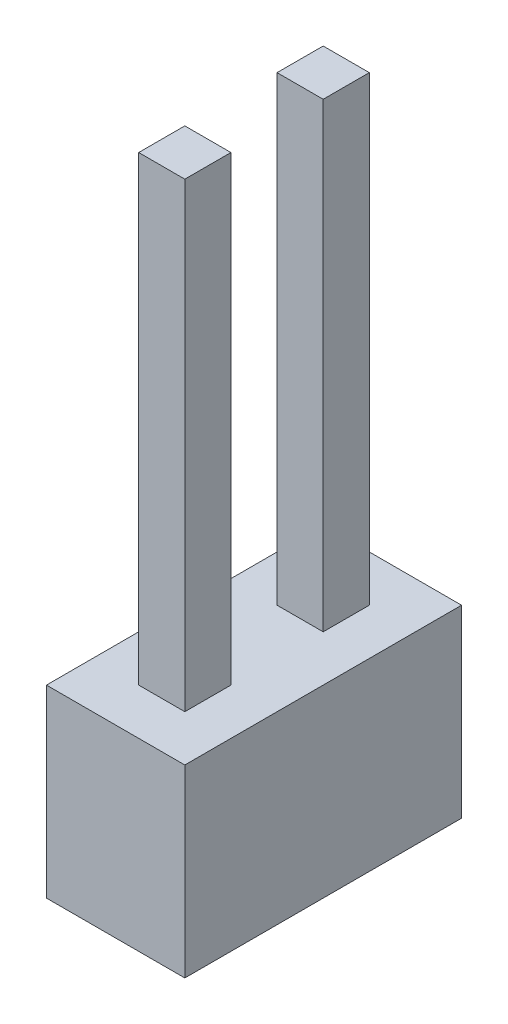
ISO-10303-21;
HEADER;
FILE_DESCRIPTION(('STEP AP214'),'2;1');
FILE_NAME('part.step','',(''),(''),'','','');
FILE_SCHEMA(('AUTOMOTIVE_DESIGN { 1 0 10303 214 1 1 1 1 }'));
ENDSEC;
DATA;
#1=APPLICATION_CONTEXT('core data for automotive mechanical design processes');
#2=APPLICATION_PROTOCOL_DEFINITION('international standard','automotive_design',2000,#1);
#3=PRODUCT_CONTEXT('',#1,'mechanical');
#4=PRODUCT('Part','Part','',(#3));
#5=PRODUCT_RELATED_PRODUCT_CATEGORY('part','',(#4));
#6=PRODUCT_DEFINITION_FORMATION('','',#4);
#7=PRODUCT_DEFINITION_CONTEXT('part definition',#1,'design');
#8=PRODUCT_DEFINITION('design','',#6,#7);
#9=PRODUCT_DEFINITION_SHAPE('','',#8);
#10=(LENGTH_UNIT() NAMED_UNIT(*) SI_UNIT(.MILLI.,.METRE.));
#11=(NAMED_UNIT(*) PLANE_ANGLE_UNIT() SI_UNIT($,.RADIAN.));
#12=(NAMED_UNIT(*) SI_UNIT($,.STERADIAN.) SOLID_ANGLE_UNIT());
#13=UNCERTAINTY_MEASURE_WITH_UNIT(LENGTH_MEASURE(1.E-05),#10,'distance_accuracy_value','');
#14=(GEOMETRIC_REPRESENTATION_CONTEXT(3) GLOBAL_UNCERTAINTY_ASSIGNED_CONTEXT((#13)) GLOBAL_UNIT_ASSIGNED_CONTEXT((#10,
#11,#12)) REPRESENTATION_CONTEXT('',''));
#15=CARTESIAN_POINT('',(0.,0.,0.));
#16=DIRECTION('',(0.,0.,1.));
#17=DIRECTION('',(1.,0.,0.));
#18=AXIS2_PLACEMENT_3D('',#15,#16,#17);
#19=CARTESIAN_POINT('',(0.,3.048,-4.572));
#20=DIRECTION('',(0.,-1.,0.));
#21=DIRECTION('',(0.,0.,-1.));
#22=AXIS2_PLACEMENT_3D('',#19,#20,#21);
#23=PLANE('',#22);
#24=DIRECTION('',(0.,0.,1.));
#25=VECTOR('',#24,1.);
#26=CARTESIAN_POINT('',(0.761999999999999,3.048,-0.762));
#27=LINE('',#26,#25);
#28=CARTESIAN_POINT('',(0.761999999999999,3.048,-1.524));
#29=VERTEX_POINT('',#28);
#30=CARTESIAN_POINT('',(0.761999999999999,3.048,-0.762));
#31=VERTEX_POINT('',#30);
#32=EDGE_CURVE('E144',#29,#31,#27,.T.);
#33=ORIENTED_EDGE('',*,*,#32,.F.);
#34=DIRECTION('',(-1.,0.,0.));
#35=VECTOR('',#34,1.);
#36=CARTESIAN_POINT('',(0.761999999999999,3.048,-1.524));
#37=LINE('',#36,#35);
#38=CARTESIAN_POINT('',(1.524,3.048,-1.524));
#39=VERTEX_POINT('',#38);
#40=EDGE_CURVE('E157',#39,#29,#37,.T.);
#41=ORIENTED_EDGE('',*,*,#40,.F.);
#42=DIRECTION('',(0.,0.,-1.));
#43=VECTOR('',#42,1.);
#44=CARTESIAN_POINT('',(1.524,3.048,-0.762));
#45=LINE('',#44,#43);
#46=CARTESIAN_POINT('',(1.524,3.048,-0.762));
#47=VERTEX_POINT('',#46);
#48=EDGE_CURVE('E166',#47,#39,#45,.T.);
#49=ORIENTED_EDGE('',*,*,#48,.F.);
#50=DIRECTION('',(1.,0.,0.));
#51=VECTOR('',#50,1.);
#52=CARTESIAN_POINT('',(0.761999999999999,3.048,-0.762));
#53=LINE('',#52,#51);
#54=EDGE_CURVE('E147',#31,#47,#53,.T.);
#55=ORIENTED_EDGE('',*,*,#54,.F.);
#56=EDGE_LOOP('',(#33,#41,#49,#55));
#57=FACE_BOUND('',#56,.T.);
#58=DIRECTION('',(0.,0.,1.));
#59=VECTOR('',#58,1.);
#60=CARTESIAN_POINT('',(0.,3.048,0.));
#61=LINE('',#60,#59);
#62=CARTESIAN_POINT('',(0.,3.048,-4.572));
#63=VERTEX_POINT('',#62);
#64=CARTESIAN_POINT('',(0.,3.048,0.));
#65=VERTEX_POINT('',#64);
#66=EDGE_CURVE('E183',#63,#65,#61,.T.);
#67=ORIENTED_EDGE('',*,*,#66,.T.);
#68=DIRECTION('',(1.,0.,0.));
#69=VECTOR('',#68,1.);
#70=CARTESIAN_POINT('',(0.,3.048,0.));
#71=LINE('',#70,#69);
#72=CARTESIAN_POINT('',(2.286,3.048,0.));
#73=VERTEX_POINT('',#72);
#74=EDGE_CURVE('E186',#65,#73,#71,.T.);
#75=ORIENTED_EDGE('',*,*,#74,.T.);
#76=DIRECTION('',(0.,0.,-1.));
#77=VECTOR('',#76,1.);
#78=CARTESIAN_POINT('',(2.286,3.048,0.));
#79=LINE('',#78,#77);
#80=CARTESIAN_POINT('',(2.286,3.048,-4.572));
#81=VERTEX_POINT('',#80);
#82=EDGE_CURVE('E189',#73,#81,#79,.T.);
#83=ORIENTED_EDGE('',*,*,#82,.T.);
#84=DIRECTION('',(-1.,0.,0.));
#85=VECTOR('',#84,1.);
#86=CARTESIAN_POINT('',(0.,3.048,-4.572));
#87=LINE('',#86,#85);
#88=EDGE_CURVE('E191',#81,#63,#87,.T.);
#89=ORIENTED_EDGE('',*,*,#88,.T.);
#90=EDGE_LOOP('',(#67,#75,#83,#89));
#91=FACE_BOUND('',#90,.T.);
#92=DIRECTION('',(0.,0.,1.));
#93=VECTOR('',#92,1.);
#94=CARTESIAN_POINT('',(0.761999999999999,3.048,-3.048));
#95=LINE('',#94,#93);
#96=CARTESIAN_POINT('',(0.761999999999999,3.048,-3.81));
#97=VERTEX_POINT('',#96);
#98=CARTESIAN_POINT('',(0.761999999999999,3.048,-3.048));
#99=VERTEX_POINT('',#98);
#100=EDGE_CURVE('E143',#97,#99,#95,.T.);
#101=ORIENTED_EDGE('',*,*,#100,.F.);
#102=DIRECTION('',(-1.,0.,0.));
#103=VECTOR('',#102,1.);
#104=CARTESIAN_POINT('',(0.761999999999999,3.048,-3.81));
#105=LINE('',#104,#103);
#106=CARTESIAN_POINT('',(1.524,3.048,-3.81));
#107=VERTEX_POINT('',#106);
#108=EDGE_CURVE('E140',#107,#97,#105,.T.);
#109=ORIENTED_EDGE('',*,*,#108,.F.);
#110=DIRECTION('',(0.,0.,-1.));
#111=VECTOR('',#110,1.);
#112=CARTESIAN_POINT('',(1.524,3.048,-3.048));
#113=LINE('',#112,#111);
#114=CARTESIAN_POINT('',(1.524,3.048,-3.048));
#115=VERTEX_POINT('',#114);
#116=EDGE_CURVE('E54',#115,#107,#113,.T.);
#117=ORIENTED_EDGE('',*,*,#116,.F.);
#118=DIRECTION('',(1.,0.,0.));
#119=VECTOR('',#118,1.);
#120=CARTESIAN_POINT('',(0.761999999999999,3.048,-3.048));
#121=LINE('',#120,#119);
#122=EDGE_CURVE('E49',#99,#115,#121,.T.);
#123=ORIENTED_EDGE('',*,*,#122,.F.);
#124=EDGE_LOOP('',(#101,#109,#117,#123));
#125=FACE_BOUND('',#124,.T.);
#126=ADVANCED_FACE('F34',(#57,#91,#125),#23,.F.);
#127=CARTESIAN_POINT('',(0.,3.048,0.));
#128=DIRECTION('',(1.,0.,0.));
#129=DIRECTION('',(0.,0.,-1.));
#130=AXIS2_PLACEMENT_3D('',#127,#128,#129);
#131=PLANE('',#130);
#132=DIRECTION('',(0.,0.,1.));
#133=VECTOR('',#132,1.);
#134=CARTESIAN_POINT('',(0.,0.,0.));
#135=LINE('',#134,#133);
#136=CARTESIAN_POINT('',(0.,0.,-4.572));
#137=VERTEX_POINT('',#136);
#138=CARTESIAN_POINT('',(0.,0.,0.));
#139=VERTEX_POINT('',#138);
#140=EDGE_CURVE('E182',#137,#139,#135,.T.);
#141=ORIENTED_EDGE('',*,*,#140,.T.);
#142=DIRECTION('',(0.,-1.,0.));
#143=VECTOR('',#142,1.);
#144=CARTESIAN_POINT('',(0.,3.048,0.));
#145=LINE('',#144,#143);
#146=EDGE_CURVE('E11',#65,#139,#145,.T.);
#147=ORIENTED_EDGE('',*,*,#146,.F.);
#148=ORIENTED_EDGE('',*,*,#66,.F.);
#149=DIRECTION('',(0.,-1.,0.));
#150=VECTOR('',#149,1.);
#151=CARTESIAN_POINT('',(0.,3.048,-4.572));
#152=LINE('',#151,#150);
#153=EDGE_CURVE('E193',#63,#137,#152,.T.);
#154=ORIENTED_EDGE('',*,*,#153,.T.);
#155=EDGE_LOOP('',(#141,#147,#148,#154));
#156=FACE_BOUND('',#155,.T.);
#157=ADVANCED_FACE('F36',(#156),#131,.F.);
#158=CARTESIAN_POINT('',(0.,3.048,0.));
#159=DIRECTION('',(0.,0.,-1.));
#160=DIRECTION('',(-1.,0.,0.));
#161=AXIS2_PLACEMENT_3D('',#158,#159,#160);
#162=PLANE('',#161);
#163=DIRECTION('',(1.,0.,0.));
#164=VECTOR('',#163,1.);
#165=CARTESIAN_POINT('',(0.,0.,0.));
#166=LINE('',#165,#164);
#167=CARTESIAN_POINT('',(2.286,0.,0.));
#168=VERTEX_POINT('',#167);
#169=EDGE_CURVE('E196',#139,#168,#166,.T.);
#170=ORIENTED_EDGE('',*,*,#169,.T.);
#171=DIRECTION('',(0.,-1.,0.));
#172=VECTOR('',#171,1.);
#173=CARTESIAN_POINT('',(2.286,3.048,0.));
#174=LINE('',#173,#172);
#175=EDGE_CURVE('E42',#73,#168,#174,.T.);
#176=ORIENTED_EDGE('',*,*,#175,.F.);
#177=ORIENTED_EDGE('',*,*,#74,.F.);
#178=ORIENTED_EDGE('',*,*,#146,.T.);
#179=EDGE_LOOP('',(#170,#176,#177,#178));
#180=FACE_BOUND('',#179,.T.);
#181=ADVANCED_FACE('F225',(#180),#162,.F.);
#182=CARTESIAN_POINT('',(2.286,3.048,0.));
#183=DIRECTION('',(-1.,0.,0.));
#184=DIRECTION('',(0.,0.,1.));
#185=AXIS2_PLACEMENT_3D('',#182,#183,#184);
#186=PLANE('',#185);
#187=DIRECTION('',(0.,0.,-1.));
#188=VECTOR('',#187,1.);
#189=CARTESIAN_POINT('',(2.286,0.,0.));
#190=LINE('',#189,#188);
#191=CARTESIAN_POINT('',(2.286,0.,-4.572));
#192=VERTEX_POINT('',#191);
#193=EDGE_CURVE('E198',#168,#192,#190,.T.);
#194=ORIENTED_EDGE('',*,*,#193,.T.);
#195=DIRECTION('',(0.,-1.,0.));
#196=VECTOR('',#195,1.);
#197=CARTESIAN_POINT('',(2.286,3.048,-4.572));
#198=LINE('',#197,#196);
#199=EDGE_CURVE('E203',#81,#192,#198,.T.);
#200=ORIENTED_EDGE('',*,*,#199,.F.);
#201=ORIENTED_EDGE('',*,*,#82,.F.);
#202=ORIENTED_EDGE('',*,*,#175,.T.);
#203=EDGE_LOOP('',(#194,#200,#201,#202));
#204=FACE_BOUND('',#203,.T.);
#205=ADVANCED_FACE('F210',(#204),#186,.F.);
#206=CARTESIAN_POINT('',(0.,3.048,-4.572));
#207=DIRECTION('',(0.,0.,1.));
#208=DIRECTION('',(1.,0.,0.));
#209=AXIS2_PLACEMENT_3D('',#206,#207,#208);
#210=PLANE('',#209);
#211=DIRECTION('',(-1.,0.,0.));
#212=VECTOR('',#211,1.);
#213=CARTESIAN_POINT('',(0.,0.,-4.572));
#214=LINE('',#213,#212);
#215=EDGE_CURVE('E187',#192,#137,#214,.T.);
#216=ORIENTED_EDGE('',*,*,#215,.T.);
#217=ORIENTED_EDGE('',*,*,#153,.F.);
#218=ORIENTED_EDGE('',*,*,#88,.F.);
#219=ORIENTED_EDGE('',*,*,#199,.T.);
#220=EDGE_LOOP('',(#216,#217,#218,#219));
#221=FACE_BOUND('',#220,.T.);
#222=ADVANCED_FACE('F219',(#221),#210,.F.);
#223=CARTESIAN_POINT('',(0.,0.,-4.572));
#224=DIRECTION('',(0.,-1.,0.));
#225=DIRECTION('',(0.,0.,-1.));
#226=AXIS2_PLACEMENT_3D('',#223,#224,#225);
#227=PLANE('',#226);
#228=ORIENTED_EDGE('',*,*,#140,.F.);
#229=ORIENTED_EDGE('',*,*,#215,.F.);
#230=ORIENTED_EDGE('',*,*,#193,.F.);
#231=ORIENTED_EDGE('',*,*,#169,.F.);
#232=EDGE_LOOP('',(#228,#229,#230,#231));
#233=FACE_BOUND('',#232,.T.);
#234=ADVANCED_FACE('F216',(#233),#227,.T.);
#235=CARTESIAN_POINT('',(0.761999999999999,10.668,-0.762));
#236=DIRECTION('',(1.,0.,0.));
#237=DIRECTION('',(0.,0.,-1.));
#238=AXIS2_PLACEMENT_3D('',#235,#236,#237);
#239=PLANE('',#238);
#240=ORIENTED_EDGE('',*,*,#32,.T.);
#241=DIRECTION('',(0.,-1.,0.));
#242=VECTOR('',#241,1.);
#243=CARTESIAN_POINT('',(0.761999999999999,10.668,-0.762));
#244=LINE('',#243,#242);
#245=CARTESIAN_POINT('',(0.761999999999999,10.668,-0.762));
#246=VERTEX_POINT('',#245);
#247=EDGE_CURVE('E179',#246,#31,#244,.T.);
#248=ORIENTED_EDGE('',*,*,#247,.F.);
#249=DIRECTION('',(0.,0.,1.));
#250=VECTOR('',#249,1.);
#251=CARTESIAN_POINT('',(0.761999999999999,10.668,-0.762));
#252=LINE('',#251,#250);
#253=CARTESIAN_POINT('',(0.761999999999999,10.668,-1.524));
#254=VERTEX_POINT('',#253);
#255=EDGE_CURVE('E153',#254,#246,#252,.T.);
#256=ORIENTED_EDGE('',*,*,#255,.F.);
#257=DIRECTION('',(0.,-1.,0.));
#258=VECTOR('',#257,1.);
#259=CARTESIAN_POINT('',(0.761999999999999,10.668,-1.524));
#260=LINE('',#259,#258);
#261=EDGE_CURVE('E162',#254,#29,#260,.T.);
#262=ORIENTED_EDGE('',*,*,#261,.T.);
#263=EDGE_LOOP('',(#240,#248,#256,#262));
#264=FACE_BOUND('',#263,.T.);
#265=ADVANCED_FACE('F239',(#264),#239,.F.);
#266=CARTESIAN_POINT('',(0.761999999999999,10.668,-0.762));
#267=DIRECTION('',(0.,0.,-1.));
#268=DIRECTION('',(-1.,0.,0.));
#269=AXIS2_PLACEMENT_3D('',#266,#267,#268);
#270=PLANE('',#269);
#271=ORIENTED_EDGE('',*,*,#54,.T.);
#272=DIRECTION('',(0.,-1.,0.));
#273=VECTOR('',#272,1.);
#274=CARTESIAN_POINT('',(1.524,10.668,-0.762));
#275=LINE('',#274,#273);
#276=CARTESIAN_POINT('',(1.524,10.668,-0.762));
#277=VERTEX_POINT('',#276);
#278=EDGE_CURVE('E176',#277,#47,#275,.T.);
#279=ORIENTED_EDGE('',*,*,#278,.F.);
#280=DIRECTION('',(1.,0.,0.));
#281=VECTOR('',#280,1.);
#282=CARTESIAN_POINT('',(0.761999999999999,10.668,-0.762));
#283=LINE('',#282,#281);
#284=EDGE_CURVE('E156',#246,#277,#283,.T.);
#285=ORIENTED_EDGE('',*,*,#284,.F.);
#286=ORIENTED_EDGE('',*,*,#247,.T.);
#287=EDGE_LOOP('',(#271,#279,#285,#286));
#288=FACE_BOUND('',#287,.T.);
#289=ADVANCED_FACE('F258',(#288),#270,.F.);
#290=CARTESIAN_POINT('',(1.524,10.668,-0.762));
#291=DIRECTION('',(-1.,0.,0.));
#292=DIRECTION('',(0.,0.,1.));
#293=AXIS2_PLACEMENT_3D('',#290,#291,#292);
#294=PLANE('',#293);
#295=ORIENTED_EDGE('',*,*,#48,.T.);
#296=DIRECTION('',(0.,-1.,0.));
#297=VECTOR('',#296,1.);
#298=CARTESIAN_POINT('',(1.524,10.668,-1.524));
#299=LINE('',#298,#297);
#300=CARTESIAN_POINT('',(1.524,10.668,-1.524));
#301=VERTEX_POINT('',#300);
#302=EDGE_CURVE('E173',#301,#39,#299,.T.);
#303=ORIENTED_EDGE('',*,*,#302,.F.);
#304=DIRECTION('',(0.,0.,-1.));
#305=VECTOR('',#304,1.);
#306=CARTESIAN_POINT('',(1.524,10.668,-0.762));
#307=LINE('',#306,#305);
#308=EDGE_CURVE('E159',#277,#301,#307,.T.);
#309=ORIENTED_EDGE('',*,*,#308,.F.);
#310=ORIENTED_EDGE('',*,*,#278,.T.);
#311=EDGE_LOOP('',(#295,#303,#309,#310));
#312=FACE_BOUND('',#311,.T.);
#313=ADVANCED_FACE('F265',(#312),#294,.F.);
#314=CARTESIAN_POINT('',(0.761999999999999,10.668,-1.524));
#315=DIRECTION('',(0.,0.,1.));
#316=DIRECTION('',(1.,0.,0.));
#317=AXIS2_PLACEMENT_3D('',#314,#315,#316);
#318=PLANE('',#317);
#319=ORIENTED_EDGE('',*,*,#40,.T.);
#320=ORIENTED_EDGE('',*,*,#261,.F.);
#321=DIRECTION('',(-1.,0.,0.));
#322=VECTOR('',#321,1.);
#323=CARTESIAN_POINT('',(0.761999999999999,10.668,-1.524));
#324=LINE('',#323,#322);
#325=EDGE_CURVE('E161',#301,#254,#324,.T.);
#326=ORIENTED_EDGE('',*,*,#325,.F.);
#327=ORIENTED_EDGE('',*,*,#302,.T.);
#328=EDGE_LOOP('',(#319,#320,#326,#327));
#329=FACE_BOUND('',#328,.T.);
#330=ADVANCED_FACE('F272',(#329),#318,.F.);
#331=CARTESIAN_POINT('',(0.761999999999999,10.668,-1.524));
#332=DIRECTION('',(0.,-1.,0.));
#333=DIRECTION('',(0.,0.,-1.));
#334=AXIS2_PLACEMENT_3D('',#331,#332,#333);
#335=PLANE('',#334);
#336=ORIENTED_EDGE('',*,*,#255,.T.);
#337=ORIENTED_EDGE('',*,*,#284,.T.);
#338=ORIENTED_EDGE('',*,*,#308,.T.);
#339=ORIENTED_EDGE('',*,*,#325,.T.);
#340=EDGE_LOOP('',(#336,#337,#338,#339));
#341=FACE_BOUND('',#340,.T.);
#342=ADVANCED_FACE('F280',(#341),#335,.F.);
#343=CARTESIAN_POINT('',(0.761999999999999,10.668,-3.048));
#344=DIRECTION('',(1.,0.,0.));
#345=DIRECTION('',(0.,0.,-1.));
#346=AXIS2_PLACEMENT_3D('',#343,#344,#345);
#347=PLANE('',#346);
#348=ORIENTED_EDGE('',*,*,#100,.T.);
#349=DIRECTION('',(0.,-1.,0.));
#350=VECTOR('',#349,1.);
#351=CARTESIAN_POINT('',(0.761999999999999,10.668,-3.048));
#352=LINE('',#351,#350);
#353=CARTESIAN_POINT('',(0.761999999999999,10.668,-3.048));
#354=VERTEX_POINT('',#353);
#355=EDGE_CURVE('E124',#354,#99,#352,.T.);
#356=ORIENTED_EDGE('',*,*,#355,.F.);
#357=DIRECTION('',(0.,0.,1.));
#358=VECTOR('',#357,1.);
#359=CARTESIAN_POINT('',(0.761999999999999,10.668,-3.048));
#360=LINE('',#359,#358);
#361=CARTESIAN_POINT('',(0.761999999999999,10.668,-3.81));
#362=VERTEX_POINT('',#361);
#363=EDGE_CURVE('E131',#362,#354,#360,.T.);
#364=ORIENTED_EDGE('',*,*,#363,.F.);
#365=DIRECTION('',(0.,-1.,0.));
#366=VECTOR('',#365,1.);
#367=CARTESIAN_POINT('',(0.761999999999999,10.668,-3.81));
#368=LINE('',#367,#366);
#369=EDGE_CURVE('E369',#362,#97,#368,.T.);
#370=ORIENTED_EDGE('',*,*,#369,.T.);
#371=EDGE_LOOP('',(#348,#356,#364,#370));
#372=FACE_BOUND('',#371,.T.);
#373=ADVANCED_FACE('F142',(#372),#347,.F.);
#374=CARTESIAN_POINT('',(0.761999999999999,10.668,-3.048));
#375=DIRECTION('',(0.,0.,-1.));
#376=DIRECTION('',(-1.,0.,0.));
#377=AXIS2_PLACEMENT_3D('',#374,#375,#376);
#378=PLANE('',#377);
#379=ORIENTED_EDGE('',*,*,#122,.T.);
#380=DIRECTION('',(0.,-1.,0.));
#381=VECTOR('',#380,1.);
#382=CARTESIAN_POINT('',(1.524,10.668,-3.048));
#383=LINE('',#382,#381);
#384=CARTESIAN_POINT('',(1.524,10.668,-3.048));
#385=VERTEX_POINT('',#384);
#386=EDGE_CURVE('E127',#385,#115,#383,.T.);
#387=ORIENTED_EDGE('',*,*,#386,.F.);
#388=DIRECTION('',(1.,0.,0.));
#389=VECTOR('',#388,1.);
#390=CARTESIAN_POINT('',(0.761999999999999,10.668,-3.048));
#391=LINE('',#390,#389);
#392=EDGE_CURVE('E120',#354,#385,#391,.T.);
#393=ORIENTED_EDGE('',*,*,#392,.F.);
#394=ORIENTED_EDGE('',*,*,#355,.T.);
#395=EDGE_LOOP('',(#379,#387,#393,#394));
#396=FACE_BOUND('',#395,.T.);
#397=ADVANCED_FACE('F122',(#396),#378,.F.);
#398=CARTESIAN_POINT('',(1.524,10.668,-3.048));
#399=DIRECTION('',(-1.,0.,0.));
#400=DIRECTION('',(0.,0.,1.));
#401=AXIS2_PLACEMENT_3D('',#398,#399,#400);
#402=PLANE('',#401);
#403=ORIENTED_EDGE('',*,*,#116,.T.);
#404=DIRECTION('',(0.,-1.,0.));
#405=VECTOR('',#404,1.);
#406=CARTESIAN_POINT('',(1.524,10.668,-3.81));
#407=LINE('',#406,#405);
#408=CARTESIAN_POINT('',(1.524,10.668,-3.81));
#409=VERTEX_POINT('',#408);
#410=EDGE_CURVE('E149',#409,#107,#407,.T.);
#411=ORIENTED_EDGE('',*,*,#410,.F.);
#412=DIRECTION('',(0.,0.,-1.));
#413=VECTOR('',#412,1.);
#414=CARTESIAN_POINT('',(1.524,10.668,-3.048));
#415=LINE('',#414,#413);
#416=EDGE_CURVE('E130',#385,#409,#415,.T.);
#417=ORIENTED_EDGE('',*,*,#416,.F.);
#418=ORIENTED_EDGE('',*,*,#386,.T.);
#419=EDGE_LOOP('',(#403,#411,#417,#418));
#420=FACE_BOUND('',#419,.T.);
#421=ADVANCED_FACE('F301',(#420),#402,.F.);
#422=CARTESIAN_POINT('',(0.761999999999999,10.668,-3.81));
#423=DIRECTION('',(0.,0.,1.));
#424=DIRECTION('',(1.,0.,0.));
#425=AXIS2_PLACEMENT_3D('',#422,#423,#424);
#426=PLANE('',#425);
#427=ORIENTED_EDGE('',*,*,#108,.T.);
#428=ORIENTED_EDGE('',*,*,#369,.F.);
#429=DIRECTION('',(-1.,0.,0.));
#430=VECTOR('',#429,1.);
#431=CARTESIAN_POINT('',(0.761999999999999,10.668,-3.81));
#432=LINE('',#431,#430);
#433=EDGE_CURVE('E136',#409,#362,#432,.T.);
#434=ORIENTED_EDGE('',*,*,#433,.F.);
#435=ORIENTED_EDGE('',*,*,#410,.T.);
#436=EDGE_LOOP('',(#427,#428,#434,#435));
#437=FACE_BOUND('',#436,.T.);
#438=ADVANCED_FACE('F308',(#437),#426,.F.);
#439=CARTESIAN_POINT('',(0.761999999999999,10.668,-3.81));
#440=DIRECTION('',(0.,-1.,0.));
#441=DIRECTION('',(0.,0.,-1.));
#442=AXIS2_PLACEMENT_3D('',#439,#440,#441);
#443=PLANE('',#442);
#444=ORIENTED_EDGE('',*,*,#363,.T.);
#445=ORIENTED_EDGE('',*,*,#392,.T.);
#446=ORIENTED_EDGE('',*,*,#416,.T.);
#447=ORIENTED_EDGE('',*,*,#433,.T.);
#448=EDGE_LOOP('',(#444,#445,#446,#447));
#449=FACE_BOUND('',#448,.T.);
#450=ADVANCED_FACE('F134',(#449),#443,.F.);
#451=CLOSED_SHELL('',(#126,#157,#181,#205,#222,#234,#265,#289,#313,#330,#342,#373,#397,#421,
#438,#450));
#452=MANIFOLD_SOLID_BREP('B2',#451);
#453=ADVANCED_BREP_SHAPE_REPRESENTATION('',(#18,#452),#14);
#454=SHAPE_DEFINITION_REPRESENTATION(#9,#453);
ENDSEC;
END-ISO-10303-21;
